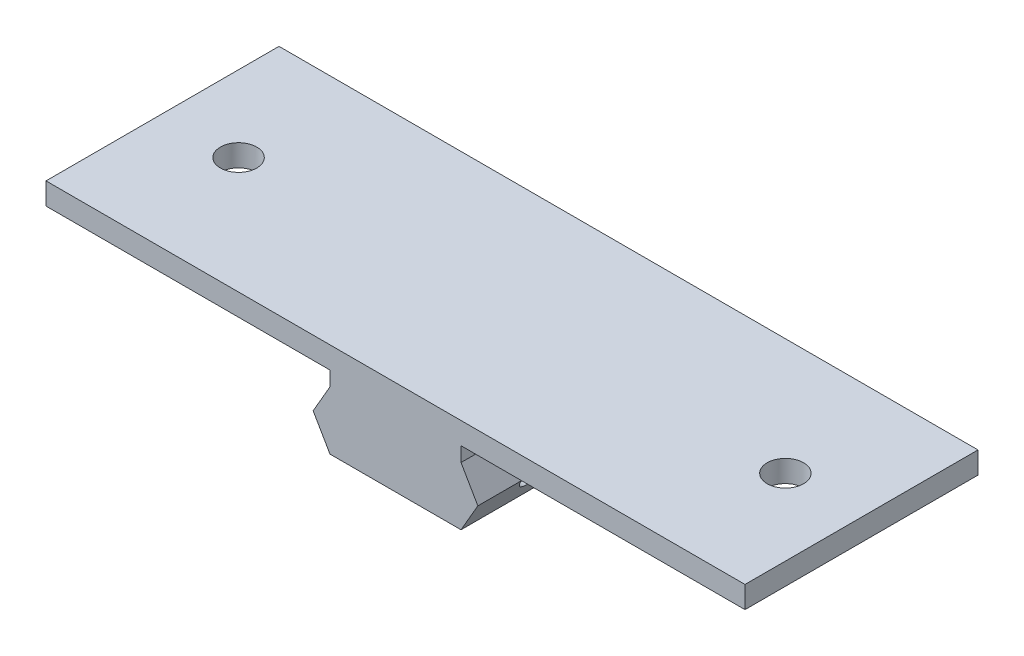
ISO-10303-21;
HEADER;
FILE_DESCRIPTION(('STEP AP214'),'2;1');
FILE_NAME('part.step','',(''),(''),'','','');
FILE_SCHEMA(('AUTOMOTIVE_DESIGN { 1 0 10303 214 1 1 1 1 }'));
ENDSEC;
DATA;
#1=APPLICATION_CONTEXT('core data for automotive mechanical design processes');
#2=APPLICATION_PROTOCOL_DEFINITION('international standard','automotive_design',2000,#1);
#3=PRODUCT_CONTEXT('',#1,'mechanical');
#4=PRODUCT('Part','Part','',(#3));
#5=PRODUCT_RELATED_PRODUCT_CATEGORY('part','',(#4));
#6=PRODUCT_DEFINITION_FORMATION('','',#4);
#7=PRODUCT_DEFINITION_CONTEXT('part definition',#1,'design');
#8=PRODUCT_DEFINITION('design','',#6,#7);
#9=PRODUCT_DEFINITION_SHAPE('','',#8);
#10=(LENGTH_UNIT() NAMED_UNIT(*) SI_UNIT(.MILLI.,.METRE.));
#11=(NAMED_UNIT(*) PLANE_ANGLE_UNIT() SI_UNIT($,.RADIAN.));
#12=(NAMED_UNIT(*) SI_UNIT($,.STERADIAN.) SOLID_ANGLE_UNIT());
#13=UNCERTAINTY_MEASURE_WITH_UNIT(LENGTH_MEASURE(1.E-05),#10,'distance_accuracy_value','');
#14=(GEOMETRIC_REPRESENTATION_CONTEXT(3) GLOBAL_UNCERTAINTY_ASSIGNED_CONTEXT((#13)) GLOBAL_UNIT_ASSIGNED_CONTEXT((#10,
#11,#12)) REPRESENTATION_CONTEXT('',''));
#15=CARTESIAN_POINT('',(0.,0.,0.));
#16=DIRECTION('',(0.,0.,1.));
#17=DIRECTION('',(1.,0.,0.));
#18=AXIS2_PLACEMENT_3D('',#15,#16,#17);
#19=CARTESIAN_POINT('',(11.3094010767585,4.00000000000005,32.));
#20=DIRECTION('',(-0.86602540378444,0.499999999999998,0.));
#21=DIRECTION('',(-0.499999999999998,-0.86602540378444,0.));
#22=AXIS2_PLACEMENT_3D('',#19,#20,#21);
#23=PLANE('',#22);
#24=DIRECTION('',(0.,0.,-1.));
#25=VECTOR('',#24,1.);
#26=CARTESIAN_POINT('',(11.3094010767585,4.00000000000005,32.));
#27=LINE('',#26,#25);
#28=CARTESIAN_POINT('',(11.3094010767585,4.00000000000005,14.));
#29=VERTEX_POINT('',#28);
#30=CARTESIAN_POINT('',(11.3094010767585,4.00000000000005,10.));
#31=VERTEX_POINT('',#30);
#32=EDGE_CURVE('E384',#29,#31,#27,.T.);
#33=ORIENTED_EDGE('',*,*,#32,.F.);
#34=CARTESIAN_POINT('',(11.3094010767585,4.00000000000005,16.));
#35=DIRECTION('',(-0.86602540378444,0.499999999999998,0.));
#36=DIRECTION('',(0.499999999999998,0.86602540378444,0.));
#37=AXIS2_PLACEMENT_3D('',#34,#35,#36);
#38=ELLIPSE('',#37,2.3094010767585,2.);
#39=CARTESIAN_POINT('',(11.3094010767585,4.00000000000005,18.));
#40=VERTEX_POINT('',#39);
#41=EDGE_CURVE('E69',#29,#40,#38,.T.);
#42=ORIENTED_EDGE('',*,*,#41,.T.);
#43=CARTESIAN_POINT('',(11.3094010767585,4.00000000000005,22.));
#44=VERTEX_POINT('',#43);
#45=EDGE_CURVE('E349',#44,#40,#27,.T.);
#46=ORIENTED_EDGE('',*,*,#45,.F.);
#47=CARTESIAN_POINT('',(11.3094010767585,4.00000000000005,24.));
#48=DIRECTION('',(-0.86602540378444,0.499999999999998,0.));
#49=DIRECTION('',(0.499999999999998,0.86602540378444,0.));
#50=AXIS2_PLACEMENT_3D('',#47,#48,#49);
#51=ELLIPSE('',#50,2.3094010767585,2.);
#52=CARTESIAN_POINT('',(11.3094010767585,4.00000000000005,26.));
#53=VERTEX_POINT('',#52);
#54=EDGE_CURVE('E286',#44,#53,#51,.T.);
#55=ORIENTED_EDGE('',*,*,#54,.T.);
#56=CARTESIAN_POINT('',(11.3094010767585,4.00000000000005,32.));
#57=VERTEX_POINT('',#56);
#58=EDGE_CURVE('E344',#57,#53,#27,.T.);
#59=ORIENTED_EDGE('',*,*,#58,.F.);
#60=DIRECTION('',(0.499999999999998,0.86602540378444,0.));
#61=VECTOR('',#60,1.);
#62=CARTESIAN_POINT('',(11.3094010767585,4.00000000000005,32.));
#63=LINE('',#62,#61);
#64=CARTESIAN_POINT('',(9.,0.,32.));
#65=VERTEX_POINT('',#64);
#66=EDGE_CURVE('E291',#65,#57,#63,.T.);
#67=ORIENTED_EDGE('',*,*,#66,.F.);
#68=DIRECTION('',(0.,0.,-1.));
#69=VECTOR('',#68,1.);
#70=CARTESIAN_POINT('',(9.,0.,32.));
#71=LINE('',#70,#69);
#72=CARTESIAN_POINT('',(9.,0.,0.));
#73=VERTEX_POINT('',#72);
#74=EDGE_CURVE('E307',#65,#73,#71,.T.);
#75=ORIENTED_EDGE('',*,*,#74,.T.);
#76=DIRECTION('',(0.499999999999998,0.86602540378444,0.));
#77=VECTOR('',#76,1.);
#78=CARTESIAN_POINT('',(11.3094010767585,4.00000000000005,0.));
#79=LINE('',#78,#77);
#80=CARTESIAN_POINT('',(11.3094010767585,4.00000000000005,0.));
#81=VERTEX_POINT('',#80);
#82=EDGE_CURVE('E290',#73,#81,#79,.T.);
#83=ORIENTED_EDGE('',*,*,#82,.T.);
#84=CARTESIAN_POINT('',(11.3094010767585,4.00000000000005,6.));
#85=VERTEX_POINT('',#84);
#86=EDGE_CURVE('E343',#85,#81,#27,.T.);
#87=ORIENTED_EDGE('',*,*,#86,.F.);
#88=CARTESIAN_POINT('',(11.3094010767585,4.00000000000005,8.));
#89=DIRECTION('',(-0.86602540378444,0.499999999999998,0.));
#90=DIRECTION('',(0.499999999999998,0.86602540378444,0.));
#91=AXIS2_PLACEMENT_3D('',#88,#89,#90);
#92=ELLIPSE('',#91,2.3094010767585,2.);
#93=EDGE_CURVE('E62',#85,#31,#92,.T.);
#94=ORIENTED_EDGE('',*,*,#93,.T.);
#95=EDGE_LOOP('',(#33,#42,#46,#55,#59,#67,#75,#83,#87,#94));
#96=FACE_BOUND('',#95,.T.);
#97=ADVANCED_FACE('F47',(#96),#23,.F.);
#98=CARTESIAN_POINT('',(9.,8.,32.));
#99=DIRECTION('',(-0.866025403784434,-0.500000000000008,0.));
#100=DIRECTION('',(0.500000000000008,-0.866025403784434,0.));
#101=AXIS2_PLACEMENT_3D('',#98,#99,#100);
#102=PLANE('',#101);
#103=ORIENTED_EDGE('',*,*,#45,.T.);
#104=CARTESIAN_POINT('',(11.3094010767585,4.00000000000005,16.));
#105=DIRECTION('',(-0.866025403784434,-0.500000000000008,0.));
#106=DIRECTION('',(0.500000000000008,-0.866025403784434,0.));
#107=AXIS2_PLACEMENT_3D('',#104,#105,#106);
#108=ELLIPSE('',#107,2.30940107675852,2.);
#109=EDGE_CURVE('E273',#40,#29,#108,.T.);
#110=ORIENTED_EDGE('',*,*,#109,.T.);
#111=ORIENTED_EDGE('',*,*,#32,.T.);
#112=CARTESIAN_POINT('',(11.3094010767585,4.00000000000005,8.));
#113=DIRECTION('',(-0.866025403784434,-0.500000000000008,0.));
#114=DIRECTION('',(0.500000000000008,-0.866025403784434,0.));
#115=AXIS2_PLACEMENT_3D('',#112,#113,#114);
#116=ELLIPSE('',#115,2.30940107675852,2.);
#117=EDGE_CURVE('E264',#31,#85,#116,.T.);
#118=ORIENTED_EDGE('',*,*,#117,.T.);
#119=ORIENTED_EDGE('',*,*,#86,.T.);
#120=DIRECTION('',(-0.500000000000008,0.866025403784434,0.));
#121=VECTOR('',#120,1.);
#122=CARTESIAN_POINT('',(9.,8.,0.));
#123=LINE('',#122,#121);
#124=CARTESIAN_POINT('',(9.,8.,0.));
#125=VERTEX_POINT('',#124);
#126=EDGE_CURVE('E311',#81,#125,#123,.T.);
#127=ORIENTED_EDGE('',*,*,#126,.T.);
#128=DIRECTION('',(0.,0.,-1.));
#129=VECTOR('',#128,1.);
#130=CARTESIAN_POINT('',(9.,8.,32.));
#131=LINE('',#130,#129);
#132=CARTESIAN_POINT('',(9.,8.,32.));
#133=VERTEX_POINT('',#132);
#134=EDGE_CURVE('E339',#133,#125,#131,.T.);
#135=ORIENTED_EDGE('',*,*,#134,.F.);
#136=DIRECTION('',(-0.500000000000008,0.866025403784434,0.));
#137=VECTOR('',#136,1.);
#138=CARTESIAN_POINT('',(9.,8.,32.));
#139=LINE('',#138,#137);
#140=EDGE_CURVE('E294',#57,#133,#139,.T.);
#141=ORIENTED_EDGE('',*,*,#140,.F.);
#142=ORIENTED_EDGE('',*,*,#58,.T.);
#143=CARTESIAN_POINT('',(11.3094010767585,4.00000000000005,24.));
#144=DIRECTION('',(-0.866025403784434,-0.500000000000008,0.));
#145=DIRECTION('',(0.500000000000008,-0.866025403784434,0.));
#146=AXIS2_PLACEMENT_3D('',#143,#144,#145);
#147=ELLIPSE('',#146,2.30940107675852,2.);
#148=EDGE_CURVE('E282',#53,#44,#147,.T.);
#149=ORIENTED_EDGE('',*,*,#148,.T.);
#150=EDGE_LOOP('',(#103,#110,#111,#118,#119,#127,#135,#141,#142,#149));
#151=FACE_BOUND('',#150,.T.);
#152=ADVANCED_FACE('F385',(#151),#102,.F.);
#153=CARTESIAN_POINT('',(-11.3094010767585,4.00000000000003,32.));
#154=DIRECTION('',(0.866025403784436,-0.500000000000005,0.));
#155=DIRECTION('',(0.500000000000005,0.866025403784436,0.));
#156=AXIS2_PLACEMENT_3D('',#153,#154,#155);
#157=PLANE('',#156);
#158=DIRECTION('',(0.,0.,-1.));
#159=VECTOR('',#158,1.);
#160=CARTESIAN_POINT('',(-11.3094010767585,4.00000000000003,32.));
#161=LINE('',#160,#159);
#162=CARTESIAN_POINT('',(-11.3094010767585,4.00000000000003,14.));
#163=VERTEX_POINT('',#162);
#164=CARTESIAN_POINT('',(-11.3094010767585,4.00000000000003,10.));
#165=VERTEX_POINT('',#164);
#166=EDGE_CURVE('E361',#163,#165,#161,.T.);
#167=ORIENTED_EDGE('',*,*,#166,.F.);
#168=CARTESIAN_POINT('',(-11.3094010767585,4.00000000000005,16.));
#169=DIRECTION('',(0.866025403784436,-0.500000000000005,0.));
#170=DIRECTION('',(0.500000000000005,0.866025403784436,0.));
#171=AXIS2_PLACEMENT_3D('',#168,#169,#170);
#172=ELLIPSE('',#171,2.30940107675851,2.);
#173=CARTESIAN_POINT('',(-11.3094010767585,4.00000000000003,18.));
#174=VERTEX_POINT('',#173);
#175=EDGE_CURVE('E269',#163,#174,#172,.T.);
#176=ORIENTED_EDGE('',*,*,#175,.T.);
#177=CARTESIAN_POINT('',(-11.3094010767585,4.00000000000003,22.));
#178=VERTEX_POINT('',#177);
#179=EDGE_CURVE('E336',#178,#174,#161,.T.);
#180=ORIENTED_EDGE('',*,*,#179,.F.);
#181=CARTESIAN_POINT('',(-11.3094010767585,4.00000000000005,24.));
#182=DIRECTION('',(0.866025403784436,-0.500000000000005,0.));
#183=DIRECTION('',(0.500000000000005,0.866025403784436,0.));
#184=AXIS2_PLACEMENT_3D('',#181,#182,#183);
#185=ELLIPSE('',#184,2.30940107675851,2.);
#186=CARTESIAN_POINT('',(-11.3094010767585,4.00000000000003,26.));
#187=VERTEX_POINT('',#186);
#188=EDGE_CURVE('E278',#178,#187,#185,.T.);
#189=ORIENTED_EDGE('',*,*,#188,.T.);
#190=CARTESIAN_POINT('',(-11.3094010767585,4.00000000000003,32.));
#191=VERTEX_POINT('',#190);
#192=EDGE_CURVE('E331',#191,#187,#161,.T.);
#193=ORIENTED_EDGE('',*,*,#192,.F.);
#194=DIRECTION('',(-0.500000000000005,-0.866025403784436,0.));
#195=VECTOR('',#194,1.);
#196=CARTESIAN_POINT('',(-11.3094010767585,4.00000000000003,32.));
#197=LINE('',#196,#195);
#198=CARTESIAN_POINT('',(-9.,7.99999999999999,32.));
#199=VERTEX_POINT('',#198);
#200=EDGE_CURVE('E298',#199,#191,#197,.T.);
#201=ORIENTED_EDGE('',*,*,#200,.F.);
#202=DIRECTION('',(0.,0.,-1.));
#203=VECTOR('',#202,1.);
#204=CARTESIAN_POINT('',(-9.,7.99999999999999,32.));
#205=LINE('',#204,#203);
#206=CARTESIAN_POINT('',(-9.,7.99999999999999,0.));
#207=VERTEX_POINT('',#206);
#208=EDGE_CURVE('E335',#199,#207,#205,.T.);
#209=ORIENTED_EDGE('',*,*,#208,.T.);
#210=DIRECTION('',(-0.500000000000005,-0.866025403784436,0.));
#211=VECTOR('',#210,1.);
#212=CARTESIAN_POINT('',(-11.3094010767585,4.00000000000003,0.));
#213=LINE('',#212,#211);
#214=CARTESIAN_POINT('',(-11.3094010767585,4.00000000000003,0.));
#215=VERTEX_POINT('',#214);
#216=EDGE_CURVE('E314',#207,#215,#213,.T.);
#217=ORIENTED_EDGE('',*,*,#216,.T.);
#218=CARTESIAN_POINT('',(-11.3094010767585,4.00000000000003,6.));
#219=VERTEX_POINT('',#218);
#220=EDGE_CURVE('E330',#219,#215,#161,.T.);
#221=ORIENTED_EDGE('',*,*,#220,.F.);
#222=CARTESIAN_POINT('',(-11.3094010767585,4.00000000000005,8.));
#223=DIRECTION('',(0.866025403784436,-0.500000000000005,0.));
#224=DIRECTION('',(0.500000000000005,0.866025403784436,0.));
#225=AXIS2_PLACEMENT_3D('',#222,#223,#224);
#226=ELLIPSE('',#225,2.30940107675851,2.);
#227=EDGE_CURVE('E260',#219,#165,#226,.T.);
#228=ORIENTED_EDGE('',*,*,#227,.T.);
#229=EDGE_LOOP('',(#167,#176,#180,#189,#193,#201,#209,#217,#221,#228));
#230=FACE_BOUND('',#229,.T.);
#231=ADVANCED_FACE('F364',(#230),#157,.F.);
#232=CARTESIAN_POINT('',(-9.,0.,32.));
#233=DIRECTION('',(0.866025403784439,0.499999999999999,0.));
#234=DIRECTION('',(-0.499999999999999,0.866025403784439,0.));
#235=AXIS2_PLACEMENT_3D('',#232,#233,#234);
#236=PLANE('',#235);
#237=ORIENTED_EDGE('',*,*,#179,.T.);
#238=CARTESIAN_POINT('',(-11.3094010767585,4.00000000000005,16.));
#239=DIRECTION('',(0.866025403784439,0.499999999999999,0.));
#240=DIRECTION('',(0.499999999999999,-0.866025403784439,0.));
#241=AXIS2_PLACEMENT_3D('',#238,#239,#240);
#242=ELLIPSE('',#241,2.3094010767585,2.);
#243=EDGE_CURVE('E11',#174,#163,#242,.T.);
#244=ORIENTED_EDGE('',*,*,#243,.T.);
#245=ORIENTED_EDGE('',*,*,#166,.T.);
#246=CARTESIAN_POINT('',(-11.3094010767585,4.00000000000005,8.));
#247=DIRECTION('',(0.866025403784439,0.499999999999999,0.));
#248=DIRECTION('',(0.499999999999999,-0.866025403784439,0.));
#249=AXIS2_PLACEMENT_3D('',#246,#247,#248);
#250=ELLIPSE('',#249,2.3094010767585,2.);
#251=EDGE_CURVE('E56',#165,#219,#250,.T.);
#252=ORIENTED_EDGE('',*,*,#251,.T.);
#253=ORIENTED_EDGE('',*,*,#220,.T.);
#254=DIRECTION('',(0.499999999999999,-0.866025403784439,0.));
#255=VECTOR('',#254,1.);
#256=CARTESIAN_POINT('',(-9.,0.,0.));
#257=LINE('',#256,#255);
#258=CARTESIAN_POINT('',(-9.,0.,0.));
#259=VERTEX_POINT('',#258);
#260=EDGE_CURVE('E318',#215,#259,#257,.T.);
#261=ORIENTED_EDGE('',*,*,#260,.T.);
#262=DIRECTION('',(0.,0.,-1.));
#263=VECTOR('',#262,1.);
#264=CARTESIAN_POINT('',(-9.,0.,32.));
#265=LINE('',#264,#263);
#266=CARTESIAN_POINT('',(-9.,0.,32.));
#267=VERTEX_POINT('',#266);
#268=EDGE_CURVE('E326',#267,#259,#265,.T.);
#269=ORIENTED_EDGE('',*,*,#268,.F.);
#270=DIRECTION('',(0.499999999999999,-0.866025403784439,0.));
#271=VECTOR('',#270,1.);
#272=CARTESIAN_POINT('',(-9.,0.,32.));
#273=LINE('',#272,#271);
#274=EDGE_CURVE('E301',#191,#267,#273,.T.);
#275=ORIENTED_EDGE('',*,*,#274,.F.);
#276=ORIENTED_EDGE('',*,*,#192,.T.);
#277=CARTESIAN_POINT('',(-11.3094010767585,4.00000000000005,24.));
#278=DIRECTION('',(0.866025403784439,0.499999999999999,0.));
#279=DIRECTION('',(0.499999999999999,-0.866025403784439,0.));
#280=AXIS2_PLACEMENT_3D('',#277,#278,#279);
#281=ELLIPSE('',#280,2.3094010767585,2.);
#282=EDGE_CURVE('E348',#187,#178,#281,.T.);
#283=ORIENTED_EDGE('',*,*,#282,.T.);
#284=EDGE_LOOP('',(#237,#244,#245,#252,#253,#261,#269,#275,#276,#283));
#285=FACE_BOUND('',#284,.T.);
#286=ADVANCED_FACE('F359',(#285),#236,.F.);
#287=CARTESIAN_POINT('',(9.,0.,32.));
#288=DIRECTION('',(0.,1.,0.));
#289=DIRECTION('',(-1.,0.,0.));
#290=AXIS2_PLACEMENT_3D('',#287,#288,#289);
#291=PLANE('',#290);
#292=DIRECTION('',(1.,0.,0.));
#293=VECTOR('',#292,1.);
#294=CARTESIAN_POINT('',(9.,0.,0.));
#295=LINE('',#294,#293);
#296=EDGE_CURVE('E295',#259,#73,#295,.T.);
#297=ORIENTED_EDGE('',*,*,#296,.T.);
#298=ORIENTED_EDGE('',*,*,#74,.F.);
#299=DIRECTION('',(1.,0.,0.));
#300=VECTOR('',#299,1.);
#301=CARTESIAN_POINT('',(9.,0.,32.));
#302=LINE('',#301,#300);
#303=EDGE_CURVE('E304',#267,#65,#302,.T.);
#304=ORIENTED_EDGE('',*,*,#303,.F.);
#305=ORIENTED_EDGE('',*,*,#268,.T.);
#306=EDGE_LOOP('',(#297,#298,#304,#305));
#307=FACE_BOUND('',#306,.T.);
#308=ADVANCED_FACE('F402',(#307),#291,.F.);
#309=CARTESIAN_POINT('',(0.,0.,32.));
#310=DIRECTION('',(0.,0.,-1.));
#311=DIRECTION('',(-1.,0.,0.));
#312=AXIS2_PLACEMENT_3D('',#309,#310,#311);
#313=PLANE('',#312);
#314=ORIENTED_EDGE('',*,*,#66,.T.);
#315=ORIENTED_EDGE('',*,*,#140,.T.);
#316=DIRECTION('',(0.,-1.,0.));
#317=VECTOR('',#316,1.);
#318=CARTESIAN_POINT('',(9.,8.,32.));
#319=LINE('',#318,#317);
#320=CARTESIAN_POINT('',(9.,10.,32.));
#321=VERTEX_POINT('',#320);
#322=EDGE_CURVE('E180',#321,#133,#319,.T.);
#323=ORIENTED_EDGE('',*,*,#322,.F.);
#324=DIRECTION('',(1.,0.,0.));
#325=VECTOR('',#324,1.);
#326=CARTESIAN_POINT('',(-48.,10.,32.));
#327=LINE('',#326,#325);
#328=CARTESIAN_POINT('',(48.,10.,32.));
#329=VERTEX_POINT('',#328);
#330=EDGE_CURVE('E173',#321,#329,#327,.T.);
#331=ORIENTED_EDGE('',*,*,#330,.T.);
#332=DIRECTION('',(0.,-1.,0.));
#333=VECTOR('',#332,1.);
#334=CARTESIAN_POINT('',(48.,10.,32.));
#335=LINE('',#334,#333);
#336=CARTESIAN_POINT('',(48.,13.,32.));
#337=VERTEX_POINT('',#336);
#338=EDGE_CURVE('E178',#337,#329,#335,.T.);
#339=ORIENTED_EDGE('',*,*,#338,.F.);
#340=DIRECTION('',(1.,0.,0.));
#341=VECTOR('',#340,1.);
#342=CARTESIAN_POINT('',(-48.,13.,32.));
#343=LINE('',#342,#341);
#344=CARTESIAN_POINT('',(-48.,13.,32.));
#345=VERTEX_POINT('',#344);
#346=EDGE_CURVE('E229',#345,#337,#343,.T.);
#347=ORIENTED_EDGE('',*,*,#346,.F.);
#348=DIRECTION('',(0.,-1.,0.));
#349=VECTOR('',#348,1.);
#350=CARTESIAN_POINT('',(-48.,10.,32.));
#351=LINE('',#350,#349);
#352=CARTESIAN_POINT('',(-48.,10.,32.));
#353=VERTEX_POINT('',#352);
#354=EDGE_CURVE('E214',#345,#353,#351,.T.);
#355=ORIENTED_EDGE('',*,*,#354,.T.);
#356=CARTESIAN_POINT('',(-9.,10.,32.));
#357=VERTEX_POINT('',#356);
#358=EDGE_CURVE('E184',#353,#357,#327,.T.);
#359=ORIENTED_EDGE('',*,*,#358,.T.);
#360=DIRECTION('',(0.,-1.,0.));
#361=VECTOR('',#360,1.);
#362=CARTESIAN_POINT('',(-9.,8.,32.));
#363=LINE('',#362,#361);
#364=EDGE_CURVE('E232',#357,#199,#363,.T.);
#365=ORIENTED_EDGE('',*,*,#364,.T.);
#366=ORIENTED_EDGE('',*,*,#200,.T.);
#367=ORIENTED_EDGE('',*,*,#274,.T.);
#368=ORIENTED_EDGE('',*,*,#303,.T.);
#369=EDGE_LOOP('',(#314,#315,#323,#331,#339,#347,#355,#359,#365,#366,#367,#368));
#370=FACE_BOUND('',#369,.T.);
#371=ADVANCED_FACE('F176',(#370),#313,.F.);
#372=CARTESIAN_POINT('',(0.,0.,0.));
#373=DIRECTION('',(0.,0.,-1.));
#374=DIRECTION('',(-1.,0.,0.));
#375=AXIS2_PLACEMENT_3D('',#372,#373,#374);
#376=PLANE('',#375);
#377=ORIENTED_EDGE('',*,*,#82,.F.);
#378=ORIENTED_EDGE('',*,*,#296,.F.);
#379=ORIENTED_EDGE('',*,*,#260,.F.);
#380=ORIENTED_EDGE('',*,*,#216,.F.);
#381=DIRECTION('',(0.,1.,0.));
#382=VECTOR('',#381,1.);
#383=CARTESIAN_POINT('',(-9.,8.,0.));
#384=LINE('',#383,#382);
#385=CARTESIAN_POINT('',(-9.,10.,0.));
#386=VERTEX_POINT('',#385);
#387=EDGE_CURVE('E244',#207,#386,#384,.T.);
#388=ORIENTED_EDGE('',*,*,#387,.T.);
#389=DIRECTION('',(1.,0.,0.));
#390=VECTOR('',#389,1.);
#391=CARTESIAN_POINT('',(-48.,10.,0.));
#392=LINE('',#391,#390);
#393=CARTESIAN_POINT('',(-48.,10.,0.));
#394=VERTEX_POINT('',#393);
#395=EDGE_CURVE('E236',#394,#386,#392,.T.);
#396=ORIENTED_EDGE('',*,*,#395,.F.);
#397=DIRECTION('',(0.,1.,0.));
#398=VECTOR('',#397,1.);
#399=CARTESIAN_POINT('',(-48.,10.,0.));
#400=LINE('',#399,#398);
#401=CARTESIAN_POINT('',(-48.,13.,0.));
#402=VERTEX_POINT('',#401);
#403=EDGE_CURVE('E222',#394,#402,#400,.T.);
#404=ORIENTED_EDGE('',*,*,#403,.T.);
#405=DIRECTION('',(1.,0.,0.));
#406=VECTOR('',#405,1.);
#407=CARTESIAN_POINT('',(-48.,13.,0.));
#408=LINE('',#407,#406);
#409=CARTESIAN_POINT('',(48.,13.,0.));
#410=VERTEX_POINT('',#409);
#411=EDGE_CURVE('E233',#402,#410,#408,.T.);
#412=ORIENTED_EDGE('',*,*,#411,.T.);
#413=DIRECTION('',(0.,1.,0.));
#414=VECTOR('',#413,1.);
#415=CARTESIAN_POINT('',(48.,10.,0.));
#416=LINE('',#415,#414);
#417=CARTESIAN_POINT('',(48.,10.,0.));
#418=VERTEX_POINT('',#417);
#419=EDGE_CURVE('E196',#418,#410,#416,.T.);
#420=ORIENTED_EDGE('',*,*,#419,.F.);
#421=CARTESIAN_POINT('',(9.,10.,0.));
#422=VERTEX_POINT('',#421);
#423=EDGE_CURVE('E191',#422,#418,#392,.T.);
#424=ORIENTED_EDGE('',*,*,#423,.F.);
#425=DIRECTION('',(0.,1.,0.));
#426=VECTOR('',#425,1.);
#427=CARTESIAN_POINT('',(9.,8.,0.));
#428=LINE('',#427,#426);
#429=EDGE_CURVE('E253',#125,#422,#428,.T.);
#430=ORIENTED_EDGE('',*,*,#429,.F.);
#431=ORIENTED_EDGE('',*,*,#126,.F.);
#432=EDGE_LOOP('',(#377,#378,#379,#380,#388,#396,#404,#412,#420,#424,#430,#431));
#433=FACE_BOUND('',#432,.T.);
#434=ADVANCED_FACE('F395',(#433),#376,.T.);
#435=CARTESIAN_POINT('',(-11.3094010767585,4.00000000000005,24.));
#436=DIRECTION('',(1.,0.,0.));
#437=DIRECTION('',(0.,0.,-1.));
#438=AXIS2_PLACEMENT_3D('',#435,#436,#437);
#439=CYLINDRICAL_SURFACE('',#438,2.);
#440=ORIENTED_EDGE('',*,*,#282,.F.);
#441=ORIENTED_EDGE('',*,*,#188,.F.);
#442=EDGE_LOOP('',(#440,#441));
#443=FACE_BOUND('',#442,.T.);
#444=ORIENTED_EDGE('',*,*,#148,.F.);
#445=ORIENTED_EDGE('',*,*,#54,.F.);
#446=EDGE_LOOP('',(#444,#445));
#447=FACE_BOUND('',#446,.T.);
#448=ADVANCED_FACE('F424',(#443,#447),#439,.F.);
#449=CARTESIAN_POINT('',(-11.3094010767585,4.00000000000005,8.));
#450=DIRECTION('',(1.,0.,0.));
#451=DIRECTION('',(0.,0.,-1.));
#452=AXIS2_PLACEMENT_3D('',#449,#450,#451);
#453=CYLINDRICAL_SURFACE('',#452,2.);
#454=ORIENTED_EDGE('',*,*,#251,.F.);
#455=ORIENTED_EDGE('',*,*,#227,.F.);
#456=EDGE_LOOP('',(#454,#455));
#457=FACE_BOUND('',#456,.T.);
#458=ORIENTED_EDGE('',*,*,#117,.F.);
#459=ORIENTED_EDGE('',*,*,#93,.F.);
#460=EDGE_LOOP('',(#458,#459));
#461=FACE_BOUND('',#460,.T.);
#462=ADVANCED_FACE('F376',(#457,#461),#453,.F.);
#463=CARTESIAN_POINT('',(-11.3094010767585,4.00000000000005,16.));
#464=DIRECTION('',(1.,0.,0.));
#465=DIRECTION('',(0.,0.,-1.));
#466=AXIS2_PLACEMENT_3D('',#463,#464,#465);
#467=CYLINDRICAL_SURFACE('',#466,2.);
#468=ORIENTED_EDGE('',*,*,#243,.F.);
#469=ORIENTED_EDGE('',*,*,#175,.F.);
#470=EDGE_LOOP('',(#468,#469));
#471=FACE_BOUND('',#470,.T.);
#472=ORIENTED_EDGE('',*,*,#109,.F.);
#473=ORIENTED_EDGE('',*,*,#41,.F.);
#474=EDGE_LOOP('',(#472,#473));
#475=FACE_BOUND('',#474,.T.);
#476=ADVANCED_FACE('F373',(#471,#475),#467,.F.);
#477=CARTESIAN_POINT('',(9.,0.,0.));
#478=DIRECTION('',(-1.,0.,0.));
#479=DIRECTION('',(0.,0.,1.));
#480=AXIS2_PLACEMENT_3D('',#477,#478,#479);
#481=PLANE('',#480);
#482=ORIENTED_EDGE('',*,*,#322,.T.);
#483=ORIENTED_EDGE('',*,*,#134,.T.);
#484=ORIENTED_EDGE('',*,*,#429,.T.);
#485=DIRECTION('',(0.,0.,1.));
#486=VECTOR('',#485,1.);
#487=CARTESIAN_POINT('',(9.,10.,32.));
#488=LINE('',#487,#486);
#489=EDGE_CURVE('E257',#422,#321,#488,.T.);
#490=ORIENTED_EDGE('',*,*,#489,.T.);
#491=EDGE_LOOP('',(#482,#483,#484,#490));
#492=FACE_BOUND('',#491,.T.);
#493=ADVANCED_FACE('F375',(#492),#481,.F.);
#494=CARTESIAN_POINT('',(-9.,0.,0.));
#495=DIRECTION('',(-1.,0.,0.));
#496=DIRECTION('',(0.,0.,1.));
#497=AXIS2_PLACEMENT_3D('',#494,#495,#496);
#498=PLANE('',#497);
#499=ORIENTED_EDGE('',*,*,#364,.F.);
#500=DIRECTION('',(0.,0.,1.));
#501=VECTOR('',#500,1.);
#502=CARTESIAN_POINT('',(-9.,10.,32.));
#503=LINE('',#502,#501);
#504=EDGE_CURVE('E248',#386,#357,#503,.T.);
#505=ORIENTED_EDGE('',*,*,#504,.F.);
#506=ORIENTED_EDGE('',*,*,#387,.F.);
#507=ORIENTED_EDGE('',*,*,#208,.F.);
#508=EDGE_LOOP('',(#499,#505,#506,#507));
#509=FACE_BOUND('',#508,.T.);
#510=ADVANCED_FACE('F409',(#509),#498,.T.);
#511=CARTESIAN_POINT('',(-48.,10.,32.));
#512=DIRECTION('',(0.,-1.,0.));
#513=DIRECTION('',(0.,0.,-1.));
#514=AXIS2_PLACEMENT_3D('',#511,#512,#513);
#515=PLANE('',#514);
#516=CARTESIAN_POINT('',(37.55,10.,16.));
#517=DIRECTION('',(0.,-1.,0.));
#518=DIRECTION('',(0.,0.,-1.));
#519=AXIS2_PLACEMENT_3D('',#516,#517,#518);
#520=CIRCLE('',#519,2.5);
#521=CARTESIAN_POINT('',(37.55,10.,13.5));
#522=VERTEX_POINT('',#521);
#523=EDGE_CURVE('E203',#522,#522,#520,.T.);
#524=ORIENTED_EDGE('',*,*,#523,.F.);
#525=EDGE_LOOP('',(#524));
#526=FACE_BOUND('',#525,.T.);
#527=ORIENTED_EDGE('',*,*,#489,.F.);
#528=ORIENTED_EDGE('',*,*,#423,.T.);
#529=DIRECTION('',(0.,0.,-1.));
#530=VECTOR('',#529,1.);
#531=CARTESIAN_POINT('',(48.,10.,32.));
#532=LINE('',#531,#530);
#533=EDGE_CURVE('E188',#329,#418,#532,.T.);
#534=ORIENTED_EDGE('',*,*,#533,.F.);
#535=ORIENTED_EDGE('',*,*,#330,.F.);
#536=EDGE_LOOP('',(#527,#528,#534,#535));
#537=FACE_BOUND('',#536,.T.);
#538=ADVANCED_FACE('F189',(#526,#537),#515,.T.);
#539=CARTESIAN_POINT('',(-48.,13.,32.));
#540=DIRECTION('',(0.,1.,0.));
#541=DIRECTION('',(0.,0.,1.));
#542=AXIS2_PLACEMENT_3D('',#539,#540,#541);
#543=PLANE('',#542);
#544=CARTESIAN_POINT('',(-37.55,13.,16.));
#545=DIRECTION('',(0.,1.,0.));
#546=DIRECTION('',(0.,0.,1.));
#547=AXIS2_PLACEMENT_3D('',#544,#545,#546);
#548=CIRCLE('',#547,2.5);
#549=CARTESIAN_POINT('',(-37.55,13.,18.5));
#550=VERTEX_POINT('',#549);
#551=EDGE_CURVE('E599',#550,#550,#548,.T.);
#552=ORIENTED_EDGE('',*,*,#551,.F.);
#553=EDGE_LOOP('',(#552));
#554=FACE_BOUND('',#553,.T.);
#555=CARTESIAN_POINT('',(37.55,13.,16.));
#556=DIRECTION('',(0.,1.,0.));
#557=DIRECTION('',(0.,0.,1.));
#558=AXIS2_PLACEMENT_3D('',#555,#556,#557);
#559=CIRCLE('',#558,2.5);
#560=CARTESIAN_POINT('',(37.55,13.,18.5));
#561=VERTEX_POINT('',#560);
#562=EDGE_CURVE('E596',#561,#561,#559,.T.);
#563=ORIENTED_EDGE('',*,*,#562,.F.);
#564=EDGE_LOOP('',(#563));
#565=FACE_BOUND('',#564,.T.);
#566=ORIENTED_EDGE('',*,*,#346,.T.);
#567=DIRECTION('',(0.,0.,1.));
#568=VECTOR('',#567,1.);
#569=CARTESIAN_POINT('',(48.,13.,32.));
#570=LINE('',#569,#568);
#571=EDGE_CURVE('E201',#410,#337,#570,.T.);
#572=ORIENTED_EDGE('',*,*,#571,.F.);
#573=ORIENTED_EDGE('',*,*,#411,.F.);
#574=DIRECTION('',(0.,0.,1.));
#575=VECTOR('',#574,1.);
#576=CARTESIAN_POINT('',(-48.,13.,32.));
#577=LINE('',#576,#575);
#578=EDGE_CURVE('E185',#402,#345,#577,.T.);
#579=ORIENTED_EDGE('',*,*,#578,.T.);
#580=EDGE_LOOP('',(#566,#572,#573,#579));
#581=FACE_BOUND('',#580,.T.);
#582=ADVANCED_FACE('F420',(#554,#565,#581),#543,.T.);
#583=CARTESIAN_POINT('',(-37.55,10.,16.));
#584=DIRECTION('',(0.,-1.,0.));
#585=DIRECTION('',(0.,0.,-1.));
#586=AXIS2_PLACEMENT_3D('',#583,#584,#585);
#587=CIRCLE('',#586,2.5);
#588=CARTESIAN_POINT('',(-37.55,10.,13.5));
#589=VERTEX_POINT('',#588);
#590=EDGE_CURVE('E50',#589,#589,#587,.T.);
#591=ORIENTED_EDGE('',*,*,#590,.F.);
#592=EDGE_LOOP('',(#591));
#593=FACE_BOUND('',#592,.T.);
#594=ORIENTED_EDGE('',*,*,#395,.T.);
#595=ORIENTED_EDGE('',*,*,#504,.T.);
#596=ORIENTED_EDGE('',*,*,#358,.F.);
#597=DIRECTION('',(0.,0.,-1.));
#598=VECTOR('',#597,1.);
#599=CARTESIAN_POINT('',(-48.,10.,32.));
#600=LINE('',#599,#598);
#601=EDGE_CURVE('E218',#353,#394,#600,.T.);
#602=ORIENTED_EDGE('',*,*,#601,.T.);
#603=EDGE_LOOP('',(#594,#595,#596,#602));
#604=FACE_BOUND('',#603,.T.);
#605=ADVANCED_FACE('F418',(#593,#604),#515,.T.);
#606=CARTESIAN_POINT('',(-48.,0.,0.));
#607=DIRECTION('',(-1.,0.,0.));
#608=DIRECTION('',(0.,0.,1.));
#609=AXIS2_PLACEMENT_3D('',#606,#607,#608);
#610=PLANE('',#609);
#611=ORIENTED_EDGE('',*,*,#354,.F.);
#612=ORIENTED_EDGE('',*,*,#578,.F.);
#613=ORIENTED_EDGE('',*,*,#403,.F.);
#614=ORIENTED_EDGE('',*,*,#601,.F.);
#615=EDGE_LOOP('',(#611,#612,#613,#614));
#616=FACE_BOUND('',#615,.T.);
#617=ADVANCED_FACE('F417',(#616),#610,.T.);
#618=CARTESIAN_POINT('',(48.,0.,0.));
#619=DIRECTION('',(-1.,0.,0.));
#620=DIRECTION('',(0.,0.,1.));
#621=AXIS2_PLACEMENT_3D('',#618,#619,#620);
#622=PLANE('',#621);
#623=ORIENTED_EDGE('',*,*,#338,.T.);
#624=ORIENTED_EDGE('',*,*,#533,.T.);
#625=ORIENTED_EDGE('',*,*,#419,.T.);
#626=ORIENTED_EDGE('',*,*,#571,.T.);
#627=EDGE_LOOP('',(#623,#624,#625,#626));
#628=FACE_BOUND('',#627,.T.);
#629=ADVANCED_FACE('F199',(#628),#622,.F.);
#630=CARTESIAN_POINT('',(-37.55,3.,16.));
#631=DIRECTION('',(0.,1.,0.));
#632=DIRECTION('',(0.,0.,1.));
#633=AXIS2_PLACEMENT_3D('',#630,#631,#632);
#634=CYLINDRICAL_SURFACE('',#633,2.5);
#635=ORIENTED_EDGE('',*,*,#590,.T.);
#636=EDGE_LOOP('',(#635));
#637=FACE_BOUND('',#636,.T.);
#638=ORIENTED_EDGE('',*,*,#551,.T.);
#639=EDGE_LOOP('',(#638));
#640=FACE_BOUND('',#639,.T.);
#641=ADVANCED_FACE('F487',(#637,#640),#634,.F.);
#642=CARTESIAN_POINT('',(37.55,3.,16.));
#643=DIRECTION('',(0.,1.,0.));
#644=DIRECTION('',(0.,0.,1.));
#645=AXIS2_PLACEMENT_3D('',#642,#643,#644);
#646=CYLINDRICAL_SURFACE('',#645,2.5);
#647=ORIENTED_EDGE('',*,*,#523,.T.);
#648=EDGE_LOOP('',(#647));
#649=FACE_BOUND('',#648,.T.);
#650=ORIENTED_EDGE('',*,*,#562,.T.);
#651=EDGE_LOOP('',(#650));
#652=FACE_BOUND('',#651,.T.);
#653=ADVANCED_FACE('F516',(#649,#652),#646,.F.);
#654=CLOSED_SHELL('',(#97,#152,#231,#286,#308,#371,#434,#448,#462,#476,#493,#510,#538,#582,#605,
#617,#629,#641,#653));
#655=MANIFOLD_SOLID_BREP('B2',#654);
#656=ADVANCED_BREP_SHAPE_REPRESENTATION('',(#18,#655),#14);
#657=SHAPE_DEFINITION_REPRESENTATION(#9,#656);
ENDSEC;
END-ISO-10303-21;
